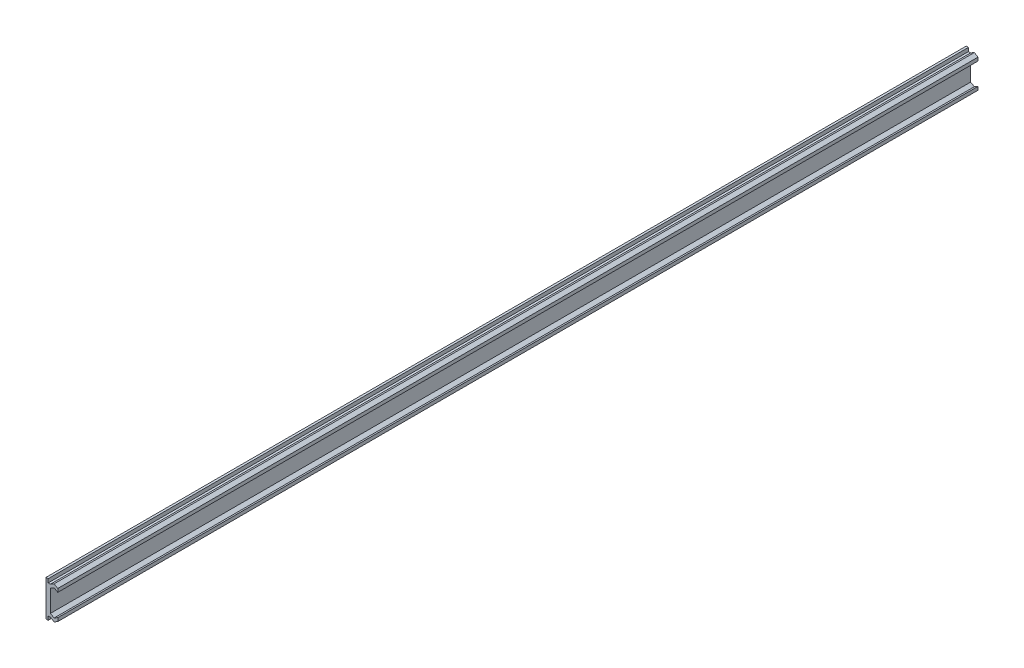
ISO-10303-21;
HEADER;
FILE_DESCRIPTION(('STEP AP214'),'2;1');
FILE_NAME('part.step','',(''),(''),'','','');
FILE_SCHEMA(('AUTOMOTIVE_DESIGN { 1 0 10303 214 1 1 1 1 }'));
ENDSEC;
DATA;
#1=APPLICATION_CONTEXT('core data for automotive mechanical design processes');
#2=APPLICATION_PROTOCOL_DEFINITION('international standard','automotive_design',2000,#1);
#3=PRODUCT_CONTEXT('',#1,'mechanical');
#4=PRODUCT('Part','Part','',(#3));
#5=PRODUCT_RELATED_PRODUCT_CATEGORY('part','',(#4));
#6=PRODUCT_DEFINITION_FORMATION('','',#4);
#7=PRODUCT_DEFINITION_CONTEXT('part definition',#1,'design');
#8=PRODUCT_DEFINITION('design','',#6,#7);
#9=PRODUCT_DEFINITION_SHAPE('','',#8);
#10=(LENGTH_UNIT() NAMED_UNIT(*) SI_UNIT(.MILLI.,.METRE.));
#11=(NAMED_UNIT(*) PLANE_ANGLE_UNIT() SI_UNIT($,.RADIAN.));
#12=(NAMED_UNIT(*) SI_UNIT($,.STERADIAN.) SOLID_ANGLE_UNIT());
#13=UNCERTAINTY_MEASURE_WITH_UNIT(LENGTH_MEASURE(1.E-05),#10,'distance_accuracy_value','');
#14=(GEOMETRIC_REPRESENTATION_CONTEXT(3) GLOBAL_UNCERTAINTY_ASSIGNED_CONTEXT((#13)) GLOBAL_UNIT_ASSIGNED_CONTEXT((#10,
#11,#12)) REPRESENTATION_CONTEXT('',''));
#15=CARTESIAN_POINT('',(0.,0.,0.));
#16=DIRECTION('',(0.,0.,1.));
#17=DIRECTION('',(1.,0.,0.));
#18=AXIS2_PLACEMENT_3D('',#15,#16,#17);
#19=CARTESIAN_POINT('',(1.17322928494561,0.273250463354415,-125.));
#20=DIRECTION('',(0.,0.,-1.));
#21=DIRECTION('',(0.707106781186548,0.707106781186548,0.));
#22=AXIS2_PLACEMENT_3D('',#19,#20,#21);
#23=PLANE('',#22);
#24=DIRECTION('',(0.,1.,0.));
#25=VECTOR('',#24,1.);
#26=CARTESIAN_POINT('',(0.0202032447835699,5.17325046335439,-125.));
#27=LINE('',#26,#25);
#28=CARTESIAN_POINT('',(0.0202032447835699,-4.62674953664556,-125.));
#29=VERTEX_POINT('',#28);
#30=CARTESIAN_POINT('',(0.0202032447835699,5.17325046335439,-125.));
#31=VERTEX_POINT('',#30);
#32=EDGE_CURVE('E11',#29,#31,#27,.T.);
#33=ORIENTED_EDGE('',*,*,#32,.T.);
#34=DIRECTION('',(1.,0.,0.));
#35=VECTOR('',#34,1.);
#36=CARTESIAN_POINT('',(0.620203244783564,5.17325046335439,-125.));
#37=LINE('',#36,#35);
#38=CARTESIAN_POINT('',(0.620203244783564,5.17325046335439,-125.));
#39=VERTEX_POINT('',#38);
#40=EDGE_CURVE('E27',#31,#39,#37,.T.);
#41=ORIENTED_EDGE('',*,*,#40,.T.);
#42=DIRECTION('',(0.,-1.,0.));
#43=VECTOR('',#42,1.);
#44=CARTESIAN_POINT('',(0.620203244783564,4.17325046335439,-125.));
#45=LINE('',#44,#43);
#46=CARTESIAN_POINT('',(0.620203244783564,4.17325046335439,-125.));
#47=VERTEX_POINT('',#46);
#48=EDGE_CURVE('E302',#39,#47,#45,.T.);
#49=ORIENTED_EDGE('',*,*,#48,.T.);
#50=DIRECTION('',(1.,0.,0.));
#51=VECTOR('',#50,1.);
#52=CARTESIAN_POINT('',(1.22020324478356,4.17325046335439,-125.));
#53=LINE('',#52,#51);
#54=CARTESIAN_POINT('',(1.22020324478356,4.17325046335439,-125.));
#55=VERTEX_POINT('',#54);
#56=EDGE_CURVE('E299',#47,#55,#53,.T.);
#57=ORIENTED_EDGE('',*,*,#56,.T.);
#58=DIRECTION('',(0.866025403784433,0.500000000000011,0.));
#59=VECTOR('',#58,1.);
#60=CARTESIAN_POINT('',(2.22020324478357,4.75060073254404,-125.));
#61=LINE('',#60,#59);
#62=CARTESIAN_POINT('',(2.22020324478357,4.75060073254404,-125.));
#63=VERTEX_POINT('',#62);
#64=EDGE_CURVE('E296',#55,#63,#61,.T.);
#65=ORIENTED_EDGE('',*,*,#64,.T.);
#66=DIRECTION('',(0.866025403784427,-0.500000000000021,0.));
#67=VECTOR('',#66,1.);
#68=CARTESIAN_POINT('',(3.22020324478356,4.17325046335439,-125.));
#69=LINE('',#68,#67);
#70=CARTESIAN_POINT('',(3.22020324478356,4.17325046335439,-125.));
#71=VERTEX_POINT('',#70);
#72=EDGE_CURVE('E293',#63,#71,#69,.T.);
#73=ORIENTED_EDGE('',*,*,#72,.T.);
#74=DIRECTION('',(0.,-1.,0.));
#75=VECTOR('',#74,1.);
#76=CARTESIAN_POINT('',(3.22020324478355,3.249490032651,-125.));
#77=LINE('',#76,#75);
#78=CARTESIAN_POINT('',(3.22020324478355,3.249490032651,-125.));
#79=VERTEX_POINT('',#78);
#80=EDGE_CURVE('E290',#71,#79,#77,.T.);
#81=ORIENTED_EDGE('',*,*,#80,.T.);
#82=DIRECTION('',(-0.86602540378445,0.49999999999998,0.));
#83=VECTOR('',#82,1.);
#84=CARTESIAN_POINT('',(2.22020324478355,3.82684030184059,-125.));
#85=LINE('',#84,#83);
#86=CARTESIAN_POINT('',(2.22020324478355,3.82684030184059,-125.));
#87=VERTEX_POINT('',#86);
#88=EDGE_CURVE('E287',#79,#87,#85,.T.);
#89=ORIENTED_EDGE('',*,*,#88,.T.);
#90=DIRECTION('',(-0.866025403784448,-0.499999999999984,0.));
#91=VECTOR('',#90,1.);
#92=CARTESIAN_POINT('',(1.22020324478356,3.249490032651,-125.));
#93=LINE('',#92,#91);
#94=CARTESIAN_POINT('',(1.22020324478356,3.249490032651,-125.));
#95=VERTEX_POINT('',#94);
#96=EDGE_CURVE('E284',#87,#95,#93,.T.);
#97=ORIENTED_EDGE('',*,*,#96,.T.);
#98=DIRECTION('',(0.,-1.,0.));
#99=VECTOR('',#98,1.);
#100=CARTESIAN_POINT('',(1.22020324478356,-2.70298910594216,-125.));
#101=LINE('',#100,#99);
#102=CARTESIAN_POINT('',(1.22020324478356,-2.70298910594216,-125.));
#103=VERTEX_POINT('',#102);
#104=EDGE_CURVE('E281',#95,#103,#101,.T.);
#105=ORIENTED_EDGE('',*,*,#104,.T.);
#106=DIRECTION('',(0.866025403784448,-0.499999999999985,0.));
#107=VECTOR('',#106,1.);
#108=CARTESIAN_POINT('',(2.22020324478355,-3.28033937513176,-125.));
#109=LINE('',#108,#107);
#110=CARTESIAN_POINT('',(2.22020324478355,-3.28033937513176,-125.));
#111=VERTEX_POINT('',#110);
#112=EDGE_CURVE('E278',#103,#111,#109,.T.);
#113=ORIENTED_EDGE('',*,*,#112,.T.);
#114=DIRECTION('',(0.86602540378445,0.499999999999981,0.));
#115=VECTOR('',#114,1.);
#116=CARTESIAN_POINT('',(3.22020324478355,-2.70298910594216,-125.));
#117=LINE('',#116,#115);
#118=CARTESIAN_POINT('',(3.22020324478355,-2.70298910594216,-125.));
#119=VERTEX_POINT('',#118);
#120=EDGE_CURVE('E275',#111,#119,#117,.T.);
#121=ORIENTED_EDGE('',*,*,#120,.T.);
#122=DIRECTION('',(0.,-1.,0.));
#123=VECTOR('',#122,1.);
#124=CARTESIAN_POINT('',(3.22020324478356,-3.62674953664557,-125.));
#125=LINE('',#124,#123);
#126=CARTESIAN_POINT('',(3.22020324478356,-3.62674953664557,-125.));
#127=VERTEX_POINT('',#126);
#128=EDGE_CURVE('E272',#119,#127,#125,.T.);
#129=ORIENTED_EDGE('',*,*,#128,.T.);
#130=DIRECTION('',(-0.866025403784427,-0.500000000000021,0.));
#131=VECTOR('',#130,1.);
#132=CARTESIAN_POINT('',(2.22020324478357,-4.20409980583521,-125.));
#133=LINE('',#132,#131);
#134=CARTESIAN_POINT('',(2.22020324478357,-4.20409980583521,-125.));
#135=VERTEX_POINT('',#134);
#136=EDGE_CURVE('E268',#127,#135,#133,.T.);
#137=ORIENTED_EDGE('',*,*,#136,.T.);
#138=DIRECTION('',(-0.866025403784433,0.500000000000011,0.));
#139=VECTOR('',#138,1.);
#140=CARTESIAN_POINT('',(1.22020324478356,-3.62674953664557,-125.));
#141=LINE('',#140,#139);
#142=CARTESIAN_POINT('',(1.22020324478356,-3.62674953664557,-125.));
#143=VERTEX_POINT('',#142);
#144=EDGE_CURVE('E266',#135,#143,#141,.T.);
#145=ORIENTED_EDGE('',*,*,#144,.T.);
#146=DIRECTION('',(-1.,0.,0.));
#147=VECTOR('',#146,1.);
#148=CARTESIAN_POINT('',(0.620203244783564,-3.62674953664557,-125.));
#149=LINE('',#148,#147);
#150=CARTESIAN_POINT('',(0.620203244783564,-3.62674953664557,-125.));
#151=VERTEX_POINT('',#150);
#152=EDGE_CURVE('E263',#143,#151,#149,.T.);
#153=ORIENTED_EDGE('',*,*,#152,.T.);
#154=DIRECTION('',(0.,-1.,0.));
#155=VECTOR('',#154,1.);
#156=CARTESIAN_POINT('',(0.620203244783564,-4.62674953664556,-125.));
#157=LINE('',#156,#155);
#158=CARTESIAN_POINT('',(0.620203244783564,-4.62674953664556,-125.));
#159=VERTEX_POINT('',#158);
#160=EDGE_CURVE('E259',#151,#159,#157,.T.);
#161=ORIENTED_EDGE('',*,*,#160,.T.);
#162=DIRECTION('',(-1.,0.,0.));
#163=VECTOR('',#162,1.);
#164=CARTESIAN_POINT('',(0.0202032447835699,-4.62674953664556,-125.));
#165=LINE('',#164,#163);
#166=EDGE_CURVE('E164',#159,#29,#165,.T.);
#167=ORIENTED_EDGE('',*,*,#166,.T.);
#168=EDGE_LOOP('',(#33,#41,#49,#57,#65,#73,#81,#89,#97,#105,#113,#121,#129,#137,#145,#153,#161,#167));
#169=FACE_BOUND('',#168,.T.);
#170=ADVANCED_FACE('F17',(#169),#23,.T.);
#171=CARTESIAN_POINT('',(0.620203244783564,5.17325046335439,0.));
#172=DIRECTION('',(0.,1.,0.));
#173=DIRECTION('',(0.707106781186548,0.,0.707106781186548));
#174=AXIS2_PLACEMENT_3D('',#171,#172,#173);
#175=PLANE('',#174);
#176=DIRECTION('',(0.,0.,-1.));
#177=VECTOR('',#176,1.);
#178=CARTESIAN_POINT('',(0.0202032447835699,5.17325046335439,0.));
#179=LINE('',#178,#177);
#180=CARTESIAN_POINT('',(0.0202032447835699,5.17325046335439,125.));
#181=VERTEX_POINT('',#180);
#182=EDGE_CURVE('E158',#181,#31,#179,.T.);
#183=ORIENTED_EDGE('',*,*,#182,.F.);
#184=DIRECTION('',(-1.,0.,0.));
#185=VECTOR('',#184,1.);
#186=CARTESIAN_POINT('',(0.620203244783564,5.17325046335439,125.));
#187=LINE('',#186,#185);
#188=CARTESIAN_POINT('',(0.620203244783564,5.17325046335439,125.));
#189=VERTEX_POINT('',#188);
#190=EDGE_CURVE('E160',#189,#181,#187,.T.);
#191=ORIENTED_EDGE('',*,*,#190,.F.);
#192=DIRECTION('',(0.,0.,1.));
#193=VECTOR('',#192,1.);
#194=CARTESIAN_POINT('',(0.620203244783564,5.17325046335439,0.));
#195=LINE('',#194,#193);
#196=EDGE_CURVE('E168',#39,#189,#195,.T.);
#197=ORIENTED_EDGE('',*,*,#196,.F.);
#198=ORIENTED_EDGE('',*,*,#40,.F.);
#199=EDGE_LOOP('',(#183,#191,#197,#198));
#200=FACE_BOUND('',#199,.T.);
#201=ADVANCED_FACE('F306',(#200),#175,.T.);
#202=CARTESIAN_POINT('',(0.620203244783564,4.17325046335439,0.));
#203=DIRECTION('',(1.,0.,0.));
#204=DIRECTION('',(0.,0.707106781186548,0.707106781186548));
#205=AXIS2_PLACEMENT_3D('',#202,#203,#204);
#206=PLANE('',#205);
#207=ORIENTED_EDGE('',*,*,#196,.T.);
#208=DIRECTION('',(0.,1.,0.));
#209=VECTOR('',#208,1.);
#210=CARTESIAN_POINT('',(0.620203244783564,4.17325046335439,125.));
#211=LINE('',#210,#209);
#212=CARTESIAN_POINT('',(0.620203244783564,4.17325046335439,125.));
#213=VERTEX_POINT('',#212);
#214=EDGE_CURVE('E167',#213,#189,#211,.T.);
#215=ORIENTED_EDGE('',*,*,#214,.F.);
#216=DIRECTION('',(0.,0.,1.));
#217=VECTOR('',#216,1.);
#218=CARTESIAN_POINT('',(0.620203244783564,4.17325046335439,0.));
#219=LINE('',#218,#217);
#220=EDGE_CURVE('E171',#47,#213,#219,.T.);
#221=ORIENTED_EDGE('',*,*,#220,.F.);
#222=ORIENTED_EDGE('',*,*,#48,.F.);
#223=EDGE_LOOP('',(#207,#215,#221,#222));
#224=FACE_BOUND('',#223,.T.);
#225=ADVANCED_FACE('F308',(#224),#206,.T.);
#226=CARTESIAN_POINT('',(1.22020324478356,4.17325046335439,0.));
#227=DIRECTION('',(0.,1.,0.));
#228=DIRECTION('',(0.707106781186548,0.,0.707106781186548));
#229=AXIS2_PLACEMENT_3D('',#226,#227,#228);
#230=PLANE('',#229);
#231=ORIENTED_EDGE('',*,*,#220,.T.);
#232=DIRECTION('',(-1.,0.,0.));
#233=VECTOR('',#232,1.);
#234=CARTESIAN_POINT('',(1.22020324478356,4.17325046335439,125.));
#235=LINE('',#234,#233);
#236=CARTESIAN_POINT('',(1.22020324478356,4.17325046335439,125.));
#237=VERTEX_POINT('',#236);
#238=EDGE_CURVE('E173',#237,#213,#235,.T.);
#239=ORIENTED_EDGE('',*,*,#238,.F.);
#240=DIRECTION('',(0.,0.,1.));
#241=VECTOR('',#240,1.);
#242=CARTESIAN_POINT('',(1.22020324478356,4.17325046335439,0.));
#243=LINE('',#242,#241);
#244=EDGE_CURVE('E176',#55,#237,#243,.T.);
#245=ORIENTED_EDGE('',*,*,#244,.F.);
#246=ORIENTED_EDGE('',*,*,#56,.F.);
#247=EDGE_LOOP('',(#231,#239,#245,#246));
#248=FACE_BOUND('',#247,.T.);
#249=ADVANCED_FACE('F311',(#248),#230,.T.);
#250=CARTESIAN_POINT('',(2.22020324478357,4.75060073254404,0.));
#251=DIRECTION('',(-0.500000000000011,0.866025403784433,0.));
#252=DIRECTION('',(0.774596669241475,0.447213595499966,0.447213595499966));
#253=AXIS2_PLACEMENT_3D('',#250,#251,#252);
#254=PLANE('',#253);
#255=ORIENTED_EDGE('',*,*,#244,.T.);
#256=DIRECTION('',(-0.866025403784433,-0.500000000000011,0.));
#257=VECTOR('',#256,1.);
#258=CARTESIAN_POINT('',(2.22020324478357,4.75060073254404,125.));
#259=LINE('',#258,#257);
#260=CARTESIAN_POINT('',(2.22020324478357,4.75060073254404,125.));
#261=VERTEX_POINT('',#260);
#262=EDGE_CURVE('E179',#261,#237,#259,.T.);
#263=ORIENTED_EDGE('',*,*,#262,.F.);
#264=DIRECTION('',(0.,0.,1.));
#265=VECTOR('',#264,1.);
#266=CARTESIAN_POINT('',(2.22020324478357,4.75060073254404,0.));
#267=LINE('',#266,#265);
#268=EDGE_CURVE('E182',#63,#261,#267,.T.);
#269=ORIENTED_EDGE('',*,*,#268,.F.);
#270=ORIENTED_EDGE('',*,*,#64,.F.);
#271=EDGE_LOOP('',(#255,#263,#269,#270));
#272=FACE_BOUND('',#271,.T.);
#273=ADVANCED_FACE('F313',(#272),#254,.T.);
#274=CARTESIAN_POINT('',(3.22020324478356,4.17325046335439,0.));
#275=DIRECTION('',(0.500000000000021,0.866025403784427,0.));
#276=DIRECTION('',(-0.774596669241466,0.447213595499973,0.447213595499973));
#277=AXIS2_PLACEMENT_3D('',#274,#275,#276);
#278=PLANE('',#277);
#279=ORIENTED_EDGE('',*,*,#268,.T.);
#280=DIRECTION('',(-0.866025403784427,0.500000000000021,0.));
#281=VECTOR('',#280,1.);
#282=CARTESIAN_POINT('',(3.22020324478356,4.17325046335439,125.));
#283=LINE('',#282,#281);
#284=CARTESIAN_POINT('',(3.22020324478356,4.17325046335439,125.));
#285=VERTEX_POINT('',#284);
#286=EDGE_CURVE('E185',#285,#261,#283,.T.);
#287=ORIENTED_EDGE('',*,*,#286,.F.);
#288=DIRECTION('',(0.,0.,1.));
#289=VECTOR('',#288,1.);
#290=CARTESIAN_POINT('',(3.22020324478356,4.17325046335439,0.));
#291=LINE('',#290,#289);
#292=EDGE_CURVE('E188',#71,#285,#291,.T.);
#293=ORIENTED_EDGE('',*,*,#292,.F.);
#294=ORIENTED_EDGE('',*,*,#72,.F.);
#295=EDGE_LOOP('',(#279,#287,#293,#294));
#296=FACE_BOUND('',#295,.T.);
#297=ADVANCED_FACE('F318',(#296),#278,.T.);
#298=CARTESIAN_POINT('',(3.22020324478355,3.249490032651,0.));
#299=DIRECTION('',(1.,0.,0.));
#300=DIRECTION('',(0.,0.707106781186548,0.707106781186548));
#301=AXIS2_PLACEMENT_3D('',#298,#299,#300);
#302=PLANE('',#301);
#303=ORIENTED_EDGE('',*,*,#292,.T.);
#304=DIRECTION('',(0.,1.,0.));
#305=VECTOR('',#304,1.);
#306=CARTESIAN_POINT('',(3.22020324478355,3.249490032651,125.));
#307=LINE('',#306,#305);
#308=CARTESIAN_POINT('',(3.22020324478355,3.249490032651,125.));
#309=VERTEX_POINT('',#308);
#310=EDGE_CURVE('E191',#309,#285,#307,.T.);
#311=ORIENTED_EDGE('',*,*,#310,.F.);
#312=DIRECTION('',(0.,0.,1.));
#313=VECTOR('',#312,1.);
#314=CARTESIAN_POINT('',(3.22020324478355,3.249490032651,0.));
#315=LINE('',#314,#313);
#316=EDGE_CURVE('E194',#79,#309,#315,.T.);
#317=ORIENTED_EDGE('',*,*,#316,.F.);
#318=ORIENTED_EDGE('',*,*,#80,.F.);
#319=EDGE_LOOP('',(#303,#311,#317,#318));
#320=FACE_BOUND('',#319,.T.);
#321=ADVANCED_FACE('F320',(#320),#302,.T.);
#322=CARTESIAN_POINT('',(2.22020324478355,3.82684030184059,0.));
#323=DIRECTION('',(-0.49999999999998,-0.86602540378445,0.));
#324=DIRECTION('',(0.654653670707982,-0.37796447300921,0.654653670707982));
#325=AXIS2_PLACEMENT_3D('',#322,#323,#324);
#326=PLANE('',#325);
#327=ORIENTED_EDGE('',*,*,#316,.T.);
#328=DIRECTION('',(0.86602540378445,-0.49999999999998,0.));
#329=VECTOR('',#328,1.);
#330=CARTESIAN_POINT('',(2.22020324478355,3.82684030184059,125.));
#331=LINE('',#330,#329);
#332=CARTESIAN_POINT('',(2.22020324478355,3.82684030184059,125.));
#333=VERTEX_POINT('',#332);
#334=EDGE_CURVE('E197',#333,#309,#331,.T.);
#335=ORIENTED_EDGE('',*,*,#334,.F.);
#336=DIRECTION('',(0.,0.,1.));
#337=VECTOR('',#336,1.);
#338=CARTESIAN_POINT('',(2.22020324478355,3.82684030184059,0.));
#339=LINE('',#338,#337);
#340=EDGE_CURVE('E200',#87,#333,#339,.T.);
#341=ORIENTED_EDGE('',*,*,#340,.F.);
#342=ORIENTED_EDGE('',*,*,#88,.F.);
#343=EDGE_LOOP('',(#327,#335,#341,#342));
#344=FACE_BOUND('',#343,.T.);
#345=ADVANCED_FACE('F323',(#344),#326,.T.);
#346=CARTESIAN_POINT('',(1.22020324478356,3.249490032651,0.));
#347=DIRECTION('',(0.499999999999984,-0.866025403784448,0.));
#348=DIRECTION('',(0.654653670707981,0.377964473009214,0.654653670707981));
#349=AXIS2_PLACEMENT_3D('',#346,#347,#348);
#350=PLANE('',#349);
#351=ORIENTED_EDGE('',*,*,#340,.T.);
#352=DIRECTION('',(0.866025403784448,0.499999999999984,0.));
#353=VECTOR('',#352,1.);
#354=CARTESIAN_POINT('',(1.22020324478356,3.249490032651,125.));
#355=LINE('',#354,#353);
#356=CARTESIAN_POINT('',(1.22020324478356,3.249490032651,125.));
#357=VERTEX_POINT('',#356);
#358=EDGE_CURVE('E203',#357,#333,#355,.T.);
#359=ORIENTED_EDGE('',*,*,#358,.F.);
#360=DIRECTION('',(0.,0.,1.));
#361=VECTOR('',#360,1.);
#362=CARTESIAN_POINT('',(1.22020324478356,3.249490032651,0.));
#363=LINE('',#362,#361);
#364=EDGE_CURVE('E206',#95,#357,#363,.T.);
#365=ORIENTED_EDGE('',*,*,#364,.F.);
#366=ORIENTED_EDGE('',*,*,#96,.F.);
#367=EDGE_LOOP('',(#351,#359,#365,#366));
#368=FACE_BOUND('',#367,.T.);
#369=ADVANCED_FACE('F325',(#368),#350,.T.);
#370=CARTESIAN_POINT('',(1.22020324478356,-2.70298910594216,0.));
#371=DIRECTION('',(1.,0.,0.));
#372=DIRECTION('',(0.,0.707106781186548,0.707106781186548));
#373=AXIS2_PLACEMENT_3D('',#370,#371,#372);
#374=PLANE('',#373);
#375=ORIENTED_EDGE('',*,*,#364,.T.);
#376=DIRECTION('',(0.,1.,0.));
#377=VECTOR('',#376,1.);
#378=CARTESIAN_POINT('',(1.22020324478356,-2.70298910594216,125.));
#379=LINE('',#378,#377);
#380=CARTESIAN_POINT('',(1.22020324478356,-2.70298910594216,125.));
#381=VERTEX_POINT('',#380);
#382=EDGE_CURVE('E209',#381,#357,#379,.T.);
#383=ORIENTED_EDGE('',*,*,#382,.F.);
#384=DIRECTION('',(0.,0.,1.));
#385=VECTOR('',#384,1.);
#386=CARTESIAN_POINT('',(1.22020324478356,-2.70298910594216,0.));
#387=LINE('',#386,#385);
#388=EDGE_CURVE('E212',#103,#381,#387,.T.);
#389=ORIENTED_EDGE('',*,*,#388,.F.);
#390=ORIENTED_EDGE('',*,*,#104,.F.);
#391=EDGE_LOOP('',(#375,#383,#389,#390));
#392=FACE_BOUND('',#391,.T.);
#393=ADVANCED_FACE('F330',(#392),#374,.T.);
#394=CARTESIAN_POINT('',(2.22020324478355,-3.28033937513176,0.));
#395=DIRECTION('',(0.499999999999985,0.866025403784448,0.));
#396=DIRECTION('',(0.654653670707981,-0.377964473009214,0.654653670707981));
#397=AXIS2_PLACEMENT_3D('',#394,#395,#396);
#398=PLANE('',#397);
#399=ORIENTED_EDGE('',*,*,#388,.T.);
#400=DIRECTION('',(-0.866025403784448,0.499999999999985,0.));
#401=VECTOR('',#400,1.);
#402=CARTESIAN_POINT('',(2.22020324478355,-3.28033937513176,125.));
#403=LINE('',#402,#401);
#404=CARTESIAN_POINT('',(2.22020324478355,-3.28033937513176,125.));
#405=VERTEX_POINT('',#404);
#406=EDGE_CURVE('E215',#405,#381,#403,.T.);
#407=ORIENTED_EDGE('',*,*,#406,.F.);
#408=DIRECTION('',(0.,0.,1.));
#409=VECTOR('',#408,1.);
#410=CARTESIAN_POINT('',(2.22020324478355,-3.28033937513176,0.));
#411=LINE('',#410,#409);
#412=EDGE_CURVE('E218',#111,#405,#411,.T.);
#413=ORIENTED_EDGE('',*,*,#412,.F.);
#414=ORIENTED_EDGE('',*,*,#112,.F.);
#415=EDGE_LOOP('',(#399,#407,#413,#414));
#416=FACE_BOUND('',#415,.T.);
#417=ADVANCED_FACE('F332',(#416),#398,.T.);
#418=CARTESIAN_POINT('',(3.22020324478355,-2.70298910594216,0.));
#419=DIRECTION('',(-0.499999999999981,0.86602540378445,0.));
#420=DIRECTION('',(0.654653670707982,0.377964473009211,0.654653670707982));
#421=AXIS2_PLACEMENT_3D('',#418,#419,#420);
#422=PLANE('',#421);
#423=ORIENTED_EDGE('',*,*,#412,.T.);
#424=DIRECTION('',(-0.86602540378445,-0.499999999999981,0.));
#425=VECTOR('',#424,1.);
#426=CARTESIAN_POINT('',(3.22020324478355,-2.70298910594216,125.));
#427=LINE('',#426,#425);
#428=CARTESIAN_POINT('',(3.22020324478355,-2.70298910594216,125.));
#429=VERTEX_POINT('',#428);
#430=EDGE_CURVE('E221',#429,#405,#427,.T.);
#431=ORIENTED_EDGE('',*,*,#430,.F.);
#432=DIRECTION('',(0.,0.,1.));
#433=VECTOR('',#432,1.);
#434=CARTESIAN_POINT('',(3.22020324478355,-2.70298910594216,0.));
#435=LINE('',#434,#433);
#436=EDGE_CURVE('E224',#119,#429,#435,.T.);
#437=ORIENTED_EDGE('',*,*,#436,.F.);
#438=ORIENTED_EDGE('',*,*,#120,.F.);
#439=EDGE_LOOP('',(#423,#431,#437,#438));
#440=FACE_BOUND('',#439,.T.);
#441=ADVANCED_FACE('F335',(#440),#422,.T.);
#442=CARTESIAN_POINT('',(3.22020324478356,-3.62674953664557,0.));
#443=DIRECTION('',(1.,0.,0.));
#444=DIRECTION('',(0.,0.707106781186548,0.707106781186548));
#445=AXIS2_PLACEMENT_3D('',#442,#443,#444);
#446=PLANE('',#445);
#447=ORIENTED_EDGE('',*,*,#436,.T.);
#448=DIRECTION('',(0.,1.,0.));
#449=VECTOR('',#448,1.);
#450=CARTESIAN_POINT('',(3.22020324478356,-3.62674953664557,125.));
#451=LINE('',#450,#449);
#452=CARTESIAN_POINT('',(3.22020324478356,-3.62674953664557,125.));
#453=VERTEX_POINT('',#452);
#454=EDGE_CURVE('E227',#453,#429,#451,.T.);
#455=ORIENTED_EDGE('',*,*,#454,.F.);
#456=DIRECTION('',(0.,0.,1.));
#457=VECTOR('',#456,1.);
#458=CARTESIAN_POINT('',(3.22020324478356,-3.62674953664557,0.));
#459=LINE('',#458,#457);
#460=EDGE_CURVE('E230',#127,#453,#459,.T.);
#461=ORIENTED_EDGE('',*,*,#460,.F.);
#462=ORIENTED_EDGE('',*,*,#128,.F.);
#463=EDGE_LOOP('',(#447,#455,#461,#462));
#464=FACE_BOUND('',#463,.T.);
#465=ADVANCED_FACE('F337',(#464),#446,.T.);
#466=CARTESIAN_POINT('',(2.22020324478357,-4.20409980583521,0.));
#467=DIRECTION('',(0.500000000000021,-0.866025403784427,0.));
#468=DIRECTION('',(0.774596669241466,0.447213595499973,0.447213595499973));
#469=AXIS2_PLACEMENT_3D('',#466,#467,#468);
#470=PLANE('',#469);
#471=ORIENTED_EDGE('',*,*,#460,.T.);
#472=DIRECTION('',(0.866025403784427,0.500000000000021,0.));
#473=VECTOR('',#472,1.);
#474=CARTESIAN_POINT('',(2.22020324478357,-4.20409980583521,125.));
#475=LINE('',#474,#473);
#476=CARTESIAN_POINT('',(2.22020324478357,-4.20409980583521,125.));
#477=VERTEX_POINT('',#476);
#478=EDGE_CURVE('E233',#477,#453,#475,.T.);
#479=ORIENTED_EDGE('',*,*,#478,.F.);
#480=DIRECTION('',(0.,0.,1.));
#481=VECTOR('',#480,1.);
#482=CARTESIAN_POINT('',(2.22020324478357,-4.20409980583521,0.));
#483=LINE('',#482,#481);
#484=EDGE_CURVE('E236',#135,#477,#483,.T.);
#485=ORIENTED_EDGE('',*,*,#484,.F.);
#486=ORIENTED_EDGE('',*,*,#136,.F.);
#487=EDGE_LOOP('',(#471,#479,#485,#486));
#488=FACE_BOUND('',#487,.T.);
#489=ADVANCED_FACE('F341',(#488),#470,.T.);
#490=CARTESIAN_POINT('',(1.22020324478356,-3.62674953664557,0.));
#491=DIRECTION('',(-0.500000000000011,-0.866025403784433,0.));
#492=DIRECTION('',(-0.774596669241475,0.447213595499966,0.447213595499966));
#493=AXIS2_PLACEMENT_3D('',#490,#491,#492);
#494=PLANE('',#493);
#495=ORIENTED_EDGE('',*,*,#484,.T.);
#496=DIRECTION('',(0.866025403784433,-0.500000000000011,0.));
#497=VECTOR('',#496,1.);
#498=CARTESIAN_POINT('',(1.22020324478356,-3.62674953664557,125.));
#499=LINE('',#498,#497);
#500=CARTESIAN_POINT('',(1.22020324478356,-3.62674953664557,125.));
#501=VERTEX_POINT('',#500);
#502=EDGE_CURVE('E239',#501,#477,#499,.T.);
#503=ORIENTED_EDGE('',*,*,#502,.F.);
#504=DIRECTION('',(0.,0.,1.));
#505=VECTOR('',#504,1.);
#506=CARTESIAN_POINT('',(1.22020324478356,-3.62674953664557,0.));
#507=LINE('',#506,#505);
#508=EDGE_CURVE('E242',#143,#501,#507,.T.);
#509=ORIENTED_EDGE('',*,*,#508,.F.);
#510=ORIENTED_EDGE('',*,*,#144,.F.);
#511=EDGE_LOOP('',(#495,#503,#509,#510));
#512=FACE_BOUND('',#511,.T.);
#513=ADVANCED_FACE('F343',(#512),#494,.T.);
#514=CARTESIAN_POINT('',(0.620203244783564,-3.62674953664557,0.));
#515=DIRECTION('',(0.,-1.,0.));
#516=DIRECTION('',(0.707106781186548,0.,0.707106781186548));
#517=AXIS2_PLACEMENT_3D('',#514,#515,#516);
#518=PLANE('',#517);
#519=ORIENTED_EDGE('',*,*,#508,.T.);
#520=DIRECTION('',(1.,0.,0.));
#521=VECTOR('',#520,1.);
#522=CARTESIAN_POINT('',(0.620203244783564,-3.62674953664557,125.));
#523=LINE('',#522,#521);
#524=CARTESIAN_POINT('',(0.620203244783564,-3.62674953664557,125.));
#525=VERTEX_POINT('',#524);
#526=EDGE_CURVE('E245',#525,#501,#523,.T.);
#527=ORIENTED_EDGE('',*,*,#526,.F.);
#528=DIRECTION('',(0.,0.,1.));
#529=VECTOR('',#528,1.);
#530=CARTESIAN_POINT('',(0.620203244783564,-3.62674953664557,0.));
#531=LINE('',#530,#529);
#532=EDGE_CURVE('E248',#151,#525,#531,.T.);
#533=ORIENTED_EDGE('',*,*,#532,.F.);
#534=ORIENTED_EDGE('',*,*,#152,.F.);
#535=EDGE_LOOP('',(#519,#527,#533,#534));
#536=FACE_BOUND('',#535,.T.);
#537=ADVANCED_FACE('F255',(#536),#518,.T.);
#538=CARTESIAN_POINT('',(0.620203244783564,-4.62674953664556,0.));
#539=DIRECTION('',(1.,0.,0.));
#540=DIRECTION('',(0.,0.707106781186548,0.707106781186548));
#541=AXIS2_PLACEMENT_3D('',#538,#539,#540);
#542=PLANE('',#541);
#543=ORIENTED_EDGE('',*,*,#532,.T.);
#544=DIRECTION('',(0.,1.,0.));
#545=VECTOR('',#544,1.);
#546=CARTESIAN_POINT('',(0.620203244783564,-4.62674953664556,125.));
#547=LINE('',#546,#545);
#548=CARTESIAN_POINT('',(0.620203244783564,-4.62674953664556,125.));
#549=VERTEX_POINT('',#548);
#550=EDGE_CURVE('E139',#549,#525,#547,.T.);
#551=ORIENTED_EDGE('',*,*,#550,.F.);
#552=DIRECTION('',(0.,0.,1.));
#553=VECTOR('',#552,1.);
#554=CARTESIAN_POINT('',(0.620203244783564,-4.62674953664556,0.));
#555=LINE('',#554,#553);
#556=EDGE_CURVE('E149',#159,#549,#555,.T.);
#557=ORIENTED_EDGE('',*,*,#556,.F.);
#558=ORIENTED_EDGE('',*,*,#160,.F.);
#559=EDGE_LOOP('',(#543,#551,#557,#558));
#560=FACE_BOUND('',#559,.T.);
#561=ADVANCED_FACE('F257',(#560),#542,.T.);
#562=CARTESIAN_POINT('',(0.0202032447835699,-4.62674953664556,0.));
#563=DIRECTION('',(0.,-1.,0.));
#564=DIRECTION('',(0.707106781186548,0.,0.707106781186548));
#565=AXIS2_PLACEMENT_3D('',#562,#563,#564);
#566=PLANE('',#565);
#567=ORIENTED_EDGE('',*,*,#556,.T.);
#568=DIRECTION('',(1.,0.,0.));
#569=VECTOR('',#568,1.);
#570=CARTESIAN_POINT('',(0.0202032447835699,-4.62674953664556,125.));
#571=LINE('',#570,#569);
#572=CARTESIAN_POINT('',(0.0202032447835699,-4.62674953664556,125.));
#573=VERTEX_POINT('',#572);
#574=EDGE_CURVE('E145',#573,#549,#571,.T.);
#575=ORIENTED_EDGE('',*,*,#574,.F.);
#576=DIRECTION('',(0.,0.,1.));
#577=VECTOR('',#576,1.);
#578=CARTESIAN_POINT('',(0.0202032447835699,-4.62674953664556,0.));
#579=LINE('',#578,#577);
#580=EDGE_CURVE('E148',#29,#573,#579,.T.);
#581=ORIENTED_EDGE('',*,*,#580,.F.);
#582=ORIENTED_EDGE('',*,*,#166,.F.);
#583=EDGE_LOOP('',(#567,#575,#581,#582));
#584=FACE_BOUND('',#583,.T.);
#585=ADVANCED_FACE('F147',(#584),#566,.T.);
#586=CARTESIAN_POINT('',(0.0202032447835699,5.17325046335439,0.));
#587=DIRECTION('',(-1.,0.,0.));
#588=DIRECTION('',(0.,0.707106781186548,0.707106781186548));
#589=AXIS2_PLACEMENT_3D('',#586,#587,#588);
#590=PLANE('',#589);
#591=ORIENTED_EDGE('',*,*,#580,.T.);
#592=DIRECTION('',(0.,-1.,0.));
#593=VECTOR('',#592,1.);
#594=CARTESIAN_POINT('',(0.0202032447835699,5.17325046335439,125.));
#595=LINE('',#594,#593);
#596=EDGE_CURVE('E21',#181,#573,#595,.T.);
#597=ORIENTED_EDGE('',*,*,#596,.F.);
#598=ORIENTED_EDGE('',*,*,#182,.T.);
#599=ORIENTED_EDGE('',*,*,#32,.F.);
#600=EDGE_LOOP('',(#591,#597,#598,#599));
#601=FACE_BOUND('',#600,.T.);
#602=ADVANCED_FACE('F156',(#601),#590,.T.);
#603=CARTESIAN_POINT('',(1.17322928494561,0.273250463354415,125.));
#604=DIRECTION('',(0.,0.,1.));
#605=DIRECTION('',(0.707106781186548,0.707106781186548,0.));
#606=AXIS2_PLACEMENT_3D('',#603,#604,#605);
#607=PLANE('',#606);
#608=ORIENTED_EDGE('',*,*,#596,.T.);
#609=ORIENTED_EDGE('',*,*,#574,.T.);
#610=ORIENTED_EDGE('',*,*,#550,.T.);
#611=ORIENTED_EDGE('',*,*,#526,.T.);
#612=ORIENTED_EDGE('',*,*,#502,.T.);
#613=ORIENTED_EDGE('',*,*,#478,.T.);
#614=ORIENTED_EDGE('',*,*,#454,.T.);
#615=ORIENTED_EDGE('',*,*,#430,.T.);
#616=ORIENTED_EDGE('',*,*,#406,.T.);
#617=ORIENTED_EDGE('',*,*,#382,.T.);
#618=ORIENTED_EDGE('',*,*,#358,.T.);
#619=ORIENTED_EDGE('',*,*,#334,.T.);
#620=ORIENTED_EDGE('',*,*,#310,.T.);
#621=ORIENTED_EDGE('',*,*,#286,.T.);
#622=ORIENTED_EDGE('',*,*,#262,.T.);
#623=ORIENTED_EDGE('',*,*,#238,.T.);
#624=ORIENTED_EDGE('',*,*,#214,.T.);
#625=ORIENTED_EDGE('',*,*,#190,.T.);
#626=EDGE_LOOP('',(#608,#609,#610,#611,#612,#613,#614,#615,#616,#617,#618,#619,#620,#621,#622,
#623,#624,#625));
#627=FACE_BOUND('',#626,.T.);
#628=ADVANCED_FACE('F19',(#627),#607,.T.);
#629=CLOSED_SHELL('',(#170,#201,#225,#249,#273,#297,#321,#345,#369,#393,#417,#441,#465,#489,
#513,#537,#561,#585,#602,#628));
#630=MANIFOLD_SOLID_BREP('B1',#629);
#631=ADVANCED_BREP_SHAPE_REPRESENTATION('',(#18,#630),#14);
#632=SHAPE_DEFINITION_REPRESENTATION(#9,#631);
ENDSEC;
END-ISO-10303-21;
